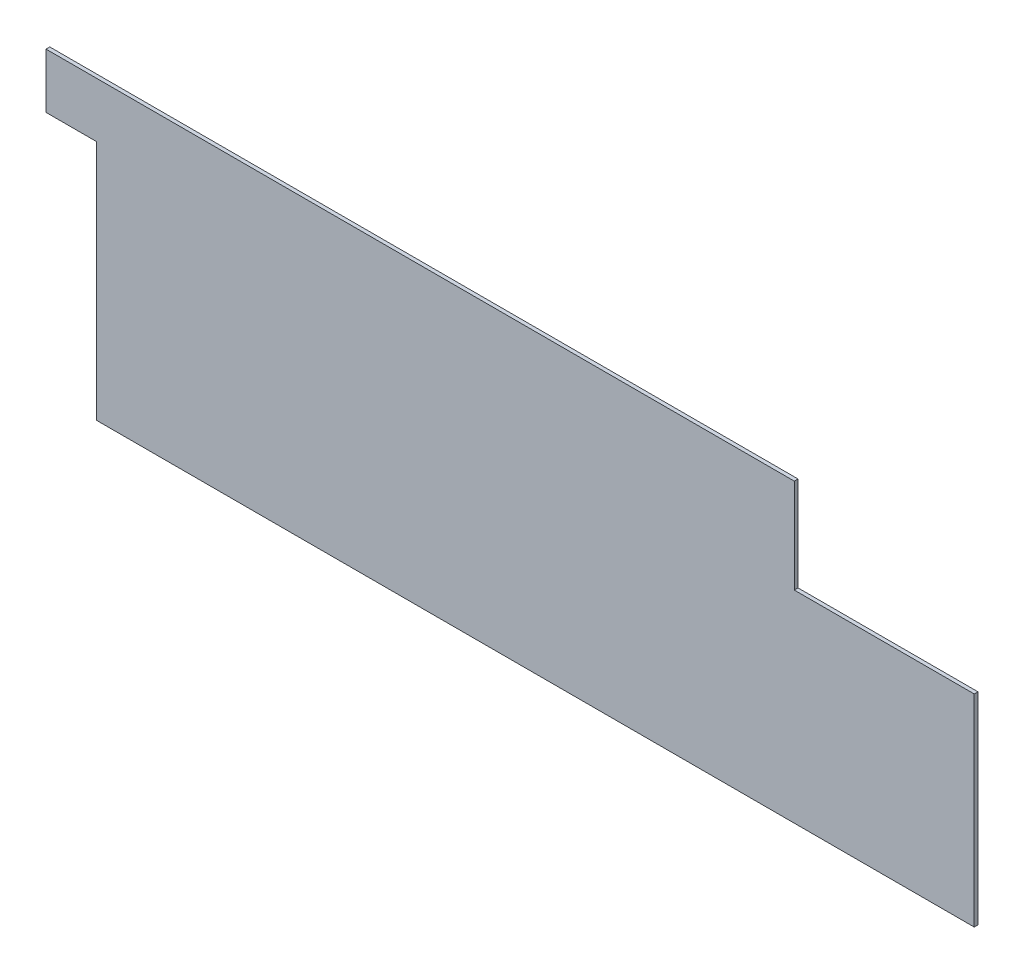
ISO-10303-21;
HEADER;
FILE_DESCRIPTION(('STEP AP214'),'2;1');
FILE_NAME('part.step','',(''),(''),'','','');
FILE_SCHEMA(('AUTOMOTIVE_DESIGN { 1 0 10303 214 1 1 1 1 }'));
ENDSEC;
DATA;
#1=APPLICATION_CONTEXT('core data for automotive mechanical design processes');
#2=APPLICATION_PROTOCOL_DEFINITION('international standard','automotive_design',2000,#1);
#3=PRODUCT_CONTEXT('',#1,'mechanical');
#4=PRODUCT('Part','Part','',(#3));
#5=PRODUCT_RELATED_PRODUCT_CATEGORY('part','',(#4));
#6=PRODUCT_DEFINITION_FORMATION('','',#4);
#7=PRODUCT_DEFINITION_CONTEXT('part definition',#1,'design');
#8=PRODUCT_DEFINITION('design','',#6,#7);
#9=PRODUCT_DEFINITION_SHAPE('','',#8);
#10=(LENGTH_UNIT() NAMED_UNIT(*) SI_UNIT(.MILLI.,.METRE.));
#11=(NAMED_UNIT(*) PLANE_ANGLE_UNIT() SI_UNIT($,.RADIAN.));
#12=(NAMED_UNIT(*) SI_UNIT($,.STERADIAN.) SOLID_ANGLE_UNIT());
#13=UNCERTAINTY_MEASURE_WITH_UNIT(LENGTH_MEASURE(1.E-05),#10,'distance_accuracy_value','');
#14=(GEOMETRIC_REPRESENTATION_CONTEXT(3) GLOBAL_UNCERTAINTY_ASSIGNED_CONTEXT((#13)) GLOBAL_UNIT_ASSIGNED_CONTEXT((#10,
#11,#12)) REPRESENTATION_CONTEXT('',''));
#15=CARTESIAN_POINT('',(0.,0.,0.));
#16=DIRECTION('',(0.,0.,1.));
#17=DIRECTION('',(1.,0.,0.));
#18=AXIS2_PLACEMENT_3D('',#15,#16,#17);
#19=CARTESIAN_POINT('',(88.4035636767519,19.9983573698409,1.99616));
#20=DIRECTION('',(0.,0.,1.));
#21=DIRECTION('',(0.,-1.,0.));
#22=AXIS2_PLACEMENT_3D('',#19,#20,#21);
#23=PLANE('',#22);
#24=DIRECTION('',(0.,-1.,0.));
#25=VECTOR('',#24,1.);
#26=CARTESIAN_POINT('',(86.527487,19.9983573698409,1.99616));
#27=LINE('',#26,#25);
#28=CARTESIAN_POINT('',(86.527487,20.432284,1.99616));
#29=VERTEX_POINT('',#28);
#30=CARTESIAN_POINT('',(86.527512,19.332309,1.99616));
#31=VERTEX_POINT('',#30);
#32=EDGE_CURVE('E96',#29,#31,#27,.T.);
#33=ORIENTED_EDGE('',*,*,#32,.F.);
#34=DIRECTION('',(1.,0.,0.));
#35=VECTOR('',#34,1.);
#36=CARTESIAN_POINT('',(88.4035636767519,20.432284,1.99616));
#37=LINE('',#36,#35);
#38=CARTESIAN_POINT('',(86.297512,20.432309,1.99616));
#39=VERTEX_POINT('',#38);
#40=EDGE_CURVE('E88',#39,#29,#37,.T.);
#41=ORIENTED_EDGE('',*,*,#40,.F.);
#42=DIRECTION('',(0.,-1.,0.));
#43=VECTOR('',#42,1.);
#44=CARTESIAN_POINT('',(86.297487,19.9983573698409,1.99616));
#45=LINE('',#44,#43);
#46=CARTESIAN_POINT('',(86.297512,20.682259,1.99616));
#47=VERTEX_POINT('',#46);
#48=EDGE_CURVE('E78',#47,#39,#45,.T.);
#49=ORIENTED_EDGE('',*,*,#48,.F.);
#50=DIRECTION('',(-1.,0.,0.));
#51=VECTOR('',#50,1.);
#52=CARTESIAN_POINT('',(88.002487,20.682284,1.99616));
#53=LINE('',#52,#51);
#54=CARTESIAN_POINT('',(89.707462,20.682259,1.99616));
#55=VERTEX_POINT('',#54);
#56=EDGE_CURVE('E132',#55,#47,#53,.T.);
#57=ORIENTED_EDGE('',*,*,#56,.F.);
#58=DIRECTION('',(0.,1.,0.));
#59=VECTOR('',#58,1.);
#60=CARTESIAN_POINT('',(89.707487,20.467259,1.99616));
#61=LINE('',#60,#59);
#62=CARTESIAN_POINT('',(89.707487,20.252284,1.99616));
#63=VERTEX_POINT('',#62);
#64=EDGE_CURVE('E107',#63,#55,#61,.T.);
#65=ORIENTED_EDGE('',*,*,#64,.F.);
#66=DIRECTION('',(-1.,0.,0.));
#67=VECTOR('',#66,1.);
#68=CARTESIAN_POINT('',(90.117462,20.252284,1.99616));
#69=LINE('',#68,#67);
#70=CARTESIAN_POINT('',(90.527462,20.252259,1.99616));
#71=VERTEX_POINT('',#70);
#72=EDGE_CURVE('E113',#71,#63,#69,.T.);
#73=ORIENTED_EDGE('',*,*,#72,.F.);
#74=DIRECTION('',(0.,1.,0.));
#75=VECTOR('',#74,1.);
#76=CARTESIAN_POINT('',(90.527487,19.792284,1.99616));
#77=LINE('',#76,#75);
#78=CARTESIAN_POINT('',(90.527462,19.332309,1.99616));
#79=VERTEX_POINT('',#78);
#80=EDGE_CURVE('E118',#79,#71,#77,.T.);
#81=ORIENTED_EDGE('',*,*,#80,.F.);
#82=DIRECTION('',(1.,0.,0.));
#83=VECTOR('',#82,1.);
#84=CARTESIAN_POINT('',(88.527487,19.332284,1.99616));
#85=LINE('',#84,#83);
#86=EDGE_CURVE('E98',#31,#79,#85,.T.);
#87=ORIENTED_EDGE('',*,*,#86,.F.);
#88=EDGE_LOOP('',(#33,#41,#49,#57,#65,#73,#81,#87));
#89=FACE_BOUND('',#88,.T.);
#90=ADVANCED_FACE('F17',(#89),#23,.F.);
#91=CARTESIAN_POINT('',(88.527487,19.332284,1.99616));
#92=DIRECTION('',(0.,-1.,0.));
#93=DIRECTION('',(1.,0.,0.));
#94=AXIS2_PLACEMENT_3D('',#91,#92,#93);
#95=PLANE('',#94);
#96=ORIENTED_EDGE('',*,*,#86,.T.);
#97=DIRECTION('',(0.,0.,-1.));
#98=VECTOR('',#97,1.);
#99=CARTESIAN_POINT('',(90.527487,19.332284,1.99616));
#100=LINE('',#99,#98);
#101=CARTESIAN_POINT('',(90.527462,19.332309,2.013254));
#102=VERTEX_POINT('',#101);
#103=EDGE_CURVE('E120',#102,#79,#100,.T.);
#104=ORIENTED_EDGE('',*,*,#103,.F.);
#105=DIRECTION('',(1.,0.,0.));
#106=VECTOR('',#105,1.);
#107=CARTESIAN_POINT('',(88.4035636767519,19.332284,2.013254));
#108=LINE('',#107,#106);
#109=CARTESIAN_POINT('',(86.527512,19.332309,2.013254));
#110=VERTEX_POINT('',#109);
#111=EDGE_CURVE('E126',#110,#102,#108,.T.);
#112=ORIENTED_EDGE('',*,*,#111,.F.);
#113=DIRECTION('',(0.,0.,1.));
#114=VECTOR('',#113,1.);
#115=CARTESIAN_POINT('',(86.527487,19.332284,1.99616));
#116=LINE('',#115,#114);
#117=EDGE_CURVE('E123',#31,#110,#116,.T.);
#118=ORIENTED_EDGE('',*,*,#117,.F.);
#119=EDGE_LOOP('',(#96,#104,#112,#118));
#120=FACE_BOUND('',#119,.T.);
#121=ADVANCED_FACE('F209',(#120),#95,.T.);
#122=CARTESIAN_POINT('',(90.527487,19.792284,1.99616));
#123=DIRECTION('',(1.,0.,0.));
#124=DIRECTION('',(0.,1.,0.));
#125=AXIS2_PLACEMENT_3D('',#122,#123,#124);
#126=PLANE('',#125);
#127=ORIENTED_EDGE('',*,*,#80,.T.);
#128=DIRECTION('',(0.,0.,-1.));
#129=VECTOR('',#128,1.);
#130=CARTESIAN_POINT('',(90.527487,20.252284,1.99616));
#131=LINE('',#130,#129);
#132=CARTESIAN_POINT('',(90.527462,20.252259,2.013254));
#133=VERTEX_POINT('',#132);
#134=EDGE_CURVE('E115',#133,#71,#131,.T.);
#135=ORIENTED_EDGE('',*,*,#134,.F.);
#136=DIRECTION('',(0.,-1.,0.));
#137=VECTOR('',#136,1.);
#138=CARTESIAN_POINT('',(90.527487,19.9983573698409,2.013254));
#139=LINE('',#138,#137);
#140=EDGE_CURVE('E179',#102,#133,#139,.F.);
#141=ORIENTED_EDGE('',*,*,#140,.F.);
#142=ORIENTED_EDGE('',*,*,#103,.T.);
#143=EDGE_LOOP('',(#127,#135,#141,#142));
#144=FACE_BOUND('',#143,.T.);
#145=ADVANCED_FACE('F207',(#144),#126,.T.);
#146=CARTESIAN_POINT('',(90.117462,20.252284,1.99616));
#147=DIRECTION('',(0.,1.,0.));
#148=DIRECTION('',(-1.,0.,0.));
#149=AXIS2_PLACEMENT_3D('',#146,#147,#148);
#150=PLANE('',#149);
#151=ORIENTED_EDGE('',*,*,#72,.T.);
#152=DIRECTION('',(0.,0.,1.));
#153=VECTOR('',#152,1.);
#154=CARTESIAN_POINT('',(89.707487,20.252284,1.99616));
#155=LINE('',#154,#153);
#156=CARTESIAN_POINT('',(89.707487,20.252284,2.013254));
#157=VERTEX_POINT('',#156);
#158=EDGE_CURVE('E110',#157,#63,#155,.F.);
#159=ORIENTED_EDGE('',*,*,#158,.F.);
#160=DIRECTION('',(1.,0.,0.));
#161=VECTOR('',#160,1.);
#162=CARTESIAN_POINT('',(88.4035636767519,20.252284,2.013254));
#163=LINE('',#162,#161);
#164=EDGE_CURVE('E184',#133,#157,#163,.F.);
#165=ORIENTED_EDGE('',*,*,#164,.F.);
#166=ORIENTED_EDGE('',*,*,#134,.T.);
#167=EDGE_LOOP('',(#151,#159,#165,#166));
#168=FACE_BOUND('',#167,.T.);
#169=ADVANCED_FACE('F206',(#168),#150,.T.);
#170=CARTESIAN_POINT('',(89.707487,20.467259,1.99616));
#171=DIRECTION('',(1.,0.,0.));
#172=DIRECTION('',(0.,1.,0.));
#173=AXIS2_PLACEMENT_3D('',#170,#171,#172);
#174=PLANE('',#173);
#175=ORIENTED_EDGE('',*,*,#64,.T.);
#176=DIRECTION('',(0.,0.,-1.));
#177=VECTOR('',#176,1.);
#178=CARTESIAN_POINT('',(89.707487,20.682284,1.99616));
#179=LINE('',#178,#177);
#180=CARTESIAN_POINT('',(89.707462,20.682259,2.013254));
#181=VERTEX_POINT('',#180);
#182=EDGE_CURVE('E109',#181,#55,#179,.T.);
#183=ORIENTED_EDGE('',*,*,#182,.F.);
#184=DIRECTION('',(0.,-1.,0.));
#185=VECTOR('',#184,1.);
#186=CARTESIAN_POINT('',(89.707487,19.9983573698409,2.013254));
#187=LINE('',#186,#185);
#188=EDGE_CURVE('E167',#157,#181,#187,.F.);
#189=ORIENTED_EDGE('',*,*,#188,.F.);
#190=ORIENTED_EDGE('',*,*,#158,.T.);
#191=EDGE_LOOP('',(#175,#183,#189,#190));
#192=FACE_BOUND('',#191,.T.);
#193=ADVANCED_FACE('F165',(#192),#174,.T.);
#194=CARTESIAN_POINT('',(88.002487,20.682284,1.99616));
#195=DIRECTION('',(0.,1.,0.));
#196=DIRECTION('',(-1.,0.,0.));
#197=AXIS2_PLACEMENT_3D('',#194,#195,#196);
#198=PLANE('',#197);
#199=ORIENTED_EDGE('',*,*,#56,.T.);
#200=DIRECTION('',(0.,0.,-1.));
#201=VECTOR('',#200,1.);
#202=CARTESIAN_POINT('',(86.297487,20.682284,1.99616));
#203=LINE('',#202,#201);
#204=CARTESIAN_POINT('',(86.297512,20.682259,2.013254));
#205=VERTEX_POINT('',#204);
#206=EDGE_CURVE('E83',#205,#47,#203,.T.);
#207=ORIENTED_EDGE('',*,*,#206,.F.);
#208=DIRECTION('',(1.,0.,0.));
#209=VECTOR('',#208,1.);
#210=CARTESIAN_POINT('',(88.4035636767519,20.682284,2.013254));
#211=LINE('',#210,#209);
#212=EDGE_CURVE('E191',#181,#205,#211,.F.);
#213=ORIENTED_EDGE('',*,*,#212,.F.);
#214=ORIENTED_EDGE('',*,*,#182,.T.);
#215=EDGE_LOOP('',(#199,#207,#213,#214));
#216=FACE_BOUND('',#215,.T.);
#217=ADVANCED_FACE('F158',(#216),#198,.T.);
#218=CARTESIAN_POINT('',(86.297487,20.557284,1.99616));
#219=DIRECTION('',(-1.,0.,0.));
#220=DIRECTION('',(0.,-1.,0.));
#221=AXIS2_PLACEMENT_3D('',#218,#219,#220);
#222=PLANE('',#221);
#223=ORIENTED_EDGE('',*,*,#48,.T.);
#224=DIRECTION('',(0.,0.,-1.));
#225=VECTOR('',#224,1.);
#226=CARTESIAN_POINT('',(86.297487,20.432284,1.99616));
#227=LINE('',#226,#225);
#228=CARTESIAN_POINT('',(86.297512,20.432309,2.013254));
#229=VERTEX_POINT('',#228);
#230=EDGE_CURVE('E82',#229,#39,#227,.T.);
#231=ORIENTED_EDGE('',*,*,#230,.F.);
#232=DIRECTION('',(0.,-1.,0.));
#233=VECTOR('',#232,1.);
#234=CARTESIAN_POINT('',(86.297487,19.9983573698409,2.013254));
#235=LINE('',#234,#233);
#236=EDGE_CURVE('E196',#205,#229,#235,.T.);
#237=ORIENTED_EDGE('',*,*,#236,.F.);
#238=ORIENTED_EDGE('',*,*,#206,.T.);
#239=EDGE_LOOP('',(#223,#231,#237,#238));
#240=FACE_BOUND('',#239,.T.);
#241=ADVANCED_FACE('F80',(#240),#222,.T.);
#242=CARTESIAN_POINT('',(86.412512,20.432284,1.99616));
#243=DIRECTION('',(0.,-1.,0.));
#244=DIRECTION('',(1.,0.,0.));
#245=AXIS2_PLACEMENT_3D('',#242,#243,#244);
#246=PLANE('',#245);
#247=ORIENTED_EDGE('',*,*,#40,.T.);
#248=DIRECTION('',(0.,0.,1.));
#249=VECTOR('',#248,1.);
#250=CARTESIAN_POINT('',(86.527487,20.432284,1.99616));
#251=LINE('',#250,#249);
#252=CARTESIAN_POINT('',(86.527487,20.432284,2.013254));
#253=VERTEX_POINT('',#252);
#254=EDGE_CURVE('E35',#253,#29,#251,.F.);
#255=ORIENTED_EDGE('',*,*,#254,.F.);
#256=DIRECTION('',(1.,0.,0.));
#257=VECTOR('',#256,1.);
#258=CARTESIAN_POINT('',(88.4035636767519,20.432284,2.013254));
#259=LINE('',#258,#257);
#260=EDGE_CURVE('E26',#229,#253,#259,.T.);
#261=ORIENTED_EDGE('',*,*,#260,.F.);
#262=ORIENTED_EDGE('',*,*,#230,.T.);
#263=EDGE_LOOP('',(#247,#255,#261,#262));
#264=FACE_BOUND('',#263,.T.);
#265=ADVANCED_FACE('F90',(#264),#246,.T.);
#266=CARTESIAN_POINT('',(86.527487,19.882309,1.99616));
#267=DIRECTION('',(-1.,0.,0.));
#268=DIRECTION('',(0.,-1.,0.));
#269=AXIS2_PLACEMENT_3D('',#266,#267,#268);
#270=PLANE('',#269);
#271=ORIENTED_EDGE('',*,*,#32,.T.);
#272=ORIENTED_EDGE('',*,*,#117,.T.);
#273=DIRECTION('',(0.,-1.,0.));
#274=VECTOR('',#273,1.);
#275=CARTESIAN_POINT('',(86.527487,19.9983573698409,2.013254));
#276=LINE('',#275,#274);
#277=EDGE_CURVE('E11',#253,#110,#276,.T.);
#278=ORIENTED_EDGE('',*,*,#277,.F.);
#279=ORIENTED_EDGE('',*,*,#254,.T.);
#280=EDGE_LOOP('',(#271,#272,#278,#279));
#281=FACE_BOUND('',#280,.T.);
#282=ADVANCED_FACE('F211',(#281),#270,.T.);
#283=CARTESIAN_POINT('',(88.4035636767519,19.9983573698409,2.013254));
#284=DIRECTION('',(0.,0.,1.));
#285=DIRECTION('',(0.,-1.,0.));
#286=AXIS2_PLACEMENT_3D('',#283,#284,#285);
#287=PLANE('',#286);
#288=ORIENTED_EDGE('',*,*,#260,.T.);
#289=ORIENTED_EDGE('',*,*,#277,.T.);
#290=ORIENTED_EDGE('',*,*,#111,.T.);
#291=ORIENTED_EDGE('',*,*,#140,.T.);
#292=ORIENTED_EDGE('',*,*,#164,.T.);
#293=ORIENTED_EDGE('',*,*,#188,.T.);
#294=ORIENTED_EDGE('',*,*,#212,.T.);
#295=ORIENTED_EDGE('',*,*,#236,.T.);
#296=EDGE_LOOP('',(#288,#289,#290,#291,#292,#293,#294,#295));
#297=FACE_BOUND('',#296,.T.);
#298=ADVANCED_FACE('F205',(#297),#287,.T.);
#299=CLOSED_SHELL('',(#90,#121,#145,#169,#193,#217,#241,#265,#282,#298));
#300=MANIFOLD_SOLID_BREP('B1',#299);
#301=ADVANCED_BREP_SHAPE_REPRESENTATION('',(#18,#300),#14);
#302=SHAPE_DEFINITION_REPRESENTATION(#9,#301);
ENDSEC;
END-ISO-10303-21;
